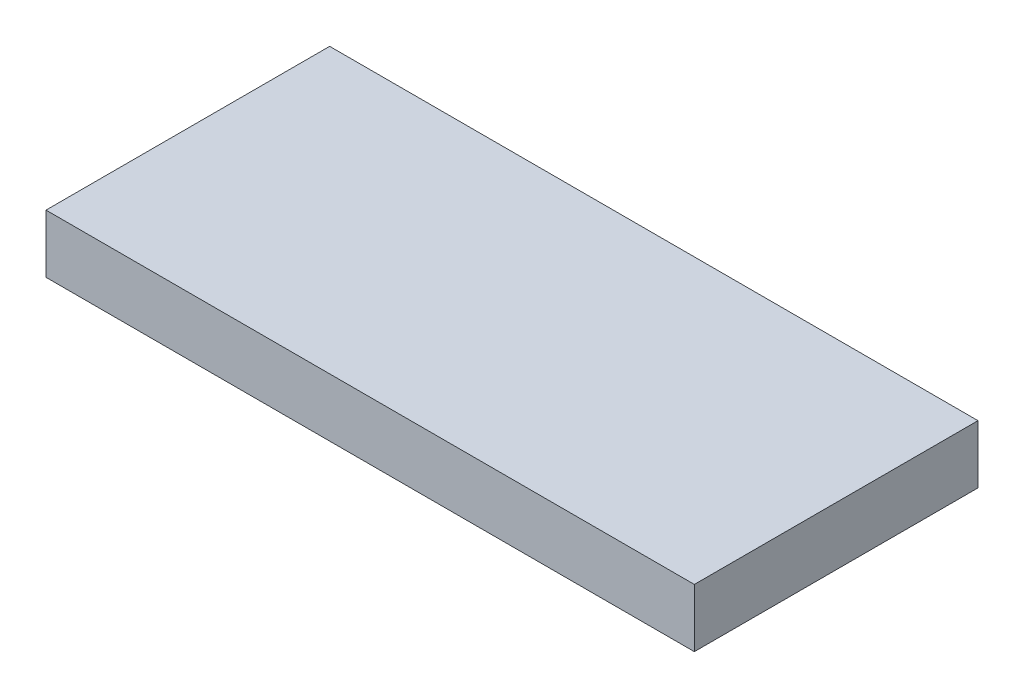
ISO-10303-21;
HEADER;
FILE_DESCRIPTION(('STEP AP214'),'2;1');
FILE_NAME('part.step','',(''),(''),'','','');
FILE_SCHEMA(('AUTOMOTIVE_DESIGN { 1 0 10303 214 1 1 1 1 }'));
ENDSEC;
DATA;
#1=APPLICATION_CONTEXT('core data for automotive mechanical design processes');
#2=APPLICATION_PROTOCOL_DEFINITION('international standard','automotive_design',2000,#1);
#3=PRODUCT_CONTEXT('',#1,'mechanical');
#4=PRODUCT('Part','Part','',(#3));
#5=PRODUCT_RELATED_PRODUCT_CATEGORY('part','',(#4));
#6=PRODUCT_DEFINITION_FORMATION('','',#4);
#7=PRODUCT_DEFINITION_CONTEXT('part definition',#1,'design');
#8=PRODUCT_DEFINITION('design','',#6,#7);
#9=PRODUCT_DEFINITION_SHAPE('','',#8);
#10=(LENGTH_UNIT() NAMED_UNIT(*) SI_UNIT(.MILLI.,.METRE.));
#11=(NAMED_UNIT(*) PLANE_ANGLE_UNIT() SI_UNIT($,.RADIAN.));
#12=(NAMED_UNIT(*) SI_UNIT($,.STERADIAN.) SOLID_ANGLE_UNIT());
#13=UNCERTAINTY_MEASURE_WITH_UNIT(LENGTH_MEASURE(1.E-05),#10,'distance_accuracy_value','');
#14=(GEOMETRIC_REPRESENTATION_CONTEXT(3) GLOBAL_UNCERTAINTY_ASSIGNED_CONTEXT((#13)) GLOBAL_UNIT_ASSIGNED_CONTEXT((#10,
#11,#12)) REPRESENTATION_CONTEXT('',''));
#15=CARTESIAN_POINT('',(0.,0.,0.));
#16=DIRECTION('',(0.,0.,1.));
#17=DIRECTION('',(1.,0.,0.));
#18=AXIS2_PLACEMENT_3D('',#15,#16,#17);
#19=CARTESIAN_POINT('',(101.6,18.25625,-44.45));
#20=DIRECTION('',(-1.,0.,0.));
#21=DIRECTION('',(0.,0.,1.));
#22=AXIS2_PLACEMENT_3D('',#19,#20,#21);
#23=PLANE('',#22);
#24=DIRECTION('',(0.,0.,-1.));
#25=VECTOR('',#24,1.);
#26=CARTESIAN_POINT('',(101.6,0.,-44.45));
#27=LINE('',#26,#25);
#28=CARTESIAN_POINT('',(101.6,0.,44.45));
#29=VERTEX_POINT('',#28);
#30=CARTESIAN_POINT('',(101.6,0.,-44.45));
#31=VERTEX_POINT('',#30);
#32=EDGE_CURVE('E95',#29,#31,#27,.T.);
#33=ORIENTED_EDGE('',*,*,#32,.T.);
#34=DIRECTION('',(0.,-1.,0.));
#35=VECTOR('',#34,1.);
#36=CARTESIAN_POINT('',(101.6,18.25625,-44.45));
#37=LINE('',#36,#35);
#38=CARTESIAN_POINT('',(101.6,18.25625,-44.45));
#39=VERTEX_POINT('',#38);
#40=EDGE_CURVE('E11',#39,#31,#37,.T.);
#41=ORIENTED_EDGE('',*,*,#40,.F.);
#42=DIRECTION('',(0.,0.,-1.));
#43=VECTOR('',#42,1.);
#44=CARTESIAN_POINT('',(101.6,18.25625,-44.45));
#45=LINE('',#44,#43);
#46=CARTESIAN_POINT('',(101.6,18.25625,44.45));
#47=VERTEX_POINT('',#46);
#48=EDGE_CURVE('E83',#47,#39,#45,.T.);
#49=ORIENTED_EDGE('',*,*,#48,.F.);
#50=DIRECTION('',(0.,-1.,0.));
#51=VECTOR('',#50,1.);
#52=CARTESIAN_POINT('',(101.6,18.25625,44.45));
#53=LINE('',#52,#51);
#54=EDGE_CURVE('E91',#47,#29,#53,.T.);
#55=ORIENTED_EDGE('',*,*,#54,.T.);
#56=EDGE_LOOP('',(#33,#41,#49,#55));
#57=FACE_BOUND('',#56,.T.);
#58=ADVANCED_FACE('F32',(#57),#23,.F.);
#59=CARTESIAN_POINT('',(-101.6,18.25625,-44.45));
#60=DIRECTION('',(0.,0.,1.));
#61=DIRECTION('',(1.,0.,0.));
#62=AXIS2_PLACEMENT_3D('',#59,#60,#61);
#63=PLANE('',#62);
#64=DIRECTION('',(-1.,0.,0.));
#65=VECTOR('',#64,1.);
#66=CARTESIAN_POINT('',(-101.6,0.,-44.45));
#67=LINE('',#66,#65);
#68=CARTESIAN_POINT('',(-101.6,0.,-44.45));
#69=VERTEX_POINT('',#68);
#70=EDGE_CURVE('E87',#31,#69,#67,.T.);
#71=ORIENTED_EDGE('',*,*,#70,.T.);
#72=DIRECTION('',(0.,-1.,0.));
#73=VECTOR('',#72,1.);
#74=CARTESIAN_POINT('',(-101.6,18.25625,-44.45));
#75=LINE('',#74,#73);
#76=CARTESIAN_POINT('',(-101.6,18.25625,-44.45));
#77=VERTEX_POINT('',#76);
#78=EDGE_CURVE('E40',#77,#69,#75,.T.);
#79=ORIENTED_EDGE('',*,*,#78,.F.);
#80=DIRECTION('',(-1.,0.,0.));
#81=VECTOR('',#80,1.);
#82=CARTESIAN_POINT('',(-101.6,18.25625,-44.45));
#83=LINE('',#82,#81);
#84=EDGE_CURVE('E78',#39,#77,#83,.T.);
#85=ORIENTED_EDGE('',*,*,#84,.F.);
#86=ORIENTED_EDGE('',*,*,#40,.T.);
#87=EDGE_LOOP('',(#71,#79,#85,#86));
#88=FACE_BOUND('',#87,.T.);
#89=ADVANCED_FACE('F86',(#88),#63,.F.);
#90=CARTESIAN_POINT('',(-101.6,18.25625,-44.45));
#91=DIRECTION('',(1.,0.,0.));
#92=DIRECTION('',(0.,0.,-1.));
#93=AXIS2_PLACEMENT_3D('',#90,#91,#92);
#94=PLANE('',#93);
#95=DIRECTION('',(0.,0.,1.));
#96=VECTOR('',#95,1.);
#97=CARTESIAN_POINT('',(-101.6,0.,-44.45));
#98=LINE('',#97,#96);
#99=CARTESIAN_POINT('',(-101.6,0.,44.45));
#100=VERTEX_POINT('',#99);
#101=EDGE_CURVE('E65',#69,#100,#98,.T.);
#102=ORIENTED_EDGE('',*,*,#101,.T.);
#103=DIRECTION('',(0.,-1.,0.));
#104=VECTOR('',#103,1.);
#105=CARTESIAN_POINT('',(-101.6,18.25625,44.45));
#106=LINE('',#105,#104);
#107=CARTESIAN_POINT('',(-101.6,18.25625,44.45));
#108=VERTEX_POINT('',#107);
#109=EDGE_CURVE('E88',#108,#100,#106,.T.);
#110=ORIENTED_EDGE('',*,*,#109,.F.);
#111=DIRECTION('',(0.,0.,1.));
#112=VECTOR('',#111,1.);
#113=CARTESIAN_POINT('',(-101.6,18.25625,-44.45));
#114=LINE('',#113,#112);
#115=EDGE_CURVE('E81',#77,#108,#114,.T.);
#116=ORIENTED_EDGE('',*,*,#115,.F.);
#117=ORIENTED_EDGE('',*,*,#78,.T.);
#118=EDGE_LOOP('',(#102,#110,#116,#117));
#119=FACE_BOUND('',#118,.T.);
#120=ADVANCED_FACE('F89',(#119),#94,.F.);
#121=CARTESIAN_POINT('',(-101.6,18.25625,44.45));
#122=DIRECTION('',(0.,0.,-1.));
#123=DIRECTION('',(-1.,0.,0.));
#124=AXIS2_PLACEMENT_3D('',#121,#122,#123);
#125=PLANE('',#124);
#126=DIRECTION('',(1.,0.,0.));
#127=VECTOR('',#126,1.);
#128=CARTESIAN_POINT('',(-101.6,0.,44.45));
#129=LINE('',#128,#127);
#130=EDGE_CURVE('E71',#100,#29,#129,.T.);
#131=ORIENTED_EDGE('',*,*,#130,.T.);
#132=ORIENTED_EDGE('',*,*,#54,.F.);
#133=DIRECTION('',(1.,0.,0.));
#134=VECTOR('',#133,1.);
#135=CARTESIAN_POINT('',(-101.6,18.25625,44.45));
#136=LINE('',#135,#134);
#137=EDGE_CURVE('E48',#108,#47,#136,.T.);
#138=ORIENTED_EDGE('',*,*,#137,.F.);
#139=ORIENTED_EDGE('',*,*,#109,.T.);
#140=EDGE_LOOP('',(#131,#132,#138,#139));
#141=FACE_BOUND('',#140,.T.);
#142=ADVANCED_FACE('F102',(#141),#125,.F.);
#143=CARTESIAN_POINT('',(0.,18.25625,0.));
#144=DIRECTION('',(0.,1.,0.));
#145=DIRECTION('',(0.,0.,1.));
#146=AXIS2_PLACEMENT_3D('',#143,#144,#145);
#147=PLANE('',#146);
#148=ORIENTED_EDGE('',*,*,#48,.T.);
#149=ORIENTED_EDGE('',*,*,#84,.T.);
#150=ORIENTED_EDGE('',*,*,#115,.T.);
#151=ORIENTED_EDGE('',*,*,#137,.T.);
#152=EDGE_LOOP('',(#148,#149,#150,#151));
#153=FACE_BOUND('',#152,.T.);
#154=ADVANCED_FACE('F79',(#153),#147,.T.);
#155=CARTESIAN_POINT('',(0.,0.,0.));
#156=DIRECTION('',(0.,1.,0.));
#157=DIRECTION('',(0.,0.,1.));
#158=AXIS2_PLACEMENT_3D('',#155,#156,#157);
#159=PLANE('',#158);
#160=ORIENTED_EDGE('',*,*,#32,.F.);
#161=ORIENTED_EDGE('',*,*,#130,.F.);
#162=ORIENTED_EDGE('',*,*,#101,.F.);
#163=ORIENTED_EDGE('',*,*,#70,.F.);
#164=EDGE_LOOP('',(#160,#161,#162,#163));
#165=FACE_BOUND('',#164,.T.);
#166=ADVANCED_FACE('F105',(#165),#159,.F.);
#167=CLOSED_SHELL('',(#58,#89,#120,#142,#154,#166));
#168=MANIFOLD_SOLID_BREP('B2',#167);
#169=ADVANCED_BREP_SHAPE_REPRESENTATION('',(#18,#168),#14);
#170=SHAPE_DEFINITION_REPRESENTATION(#9,#169);
ENDSEC;
END-ISO-10303-21;
